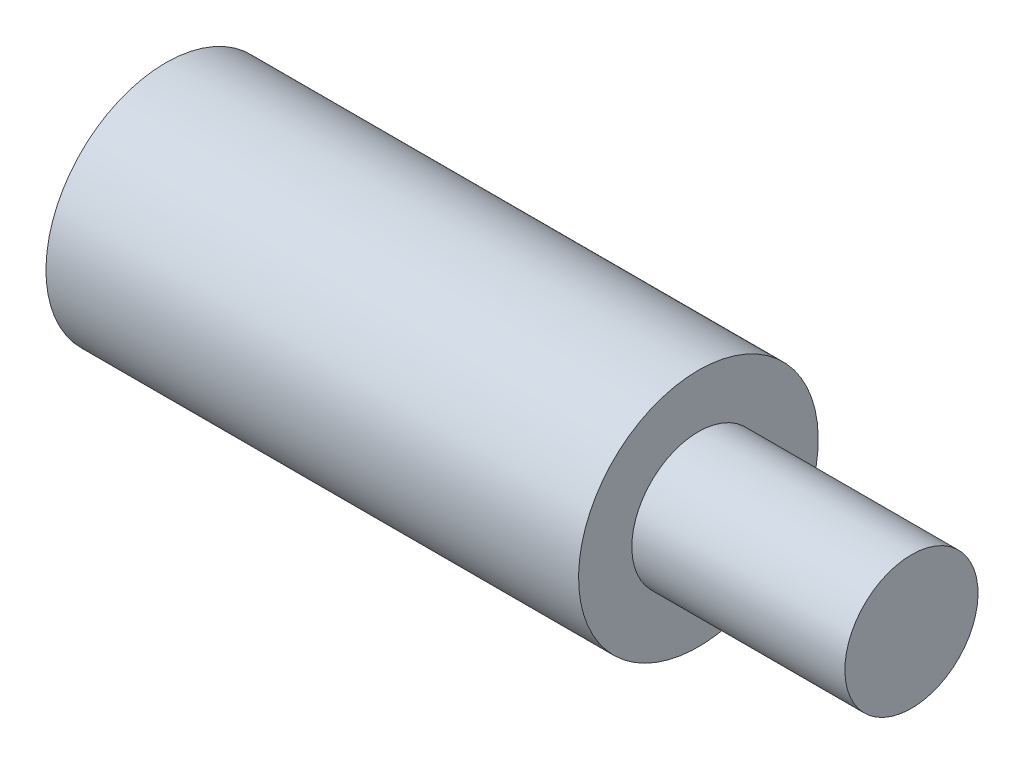
ISO-10303-21;
HEADER;
FILE_DESCRIPTION(('STEP AP214'),'2;1');
FILE_NAME('part.step','',(''),(''),'','','');
FILE_SCHEMA(('AUTOMOTIVE_DESIGN { 1 0 10303 214 1 1 1 1 }'));
ENDSEC;
DATA;
#1=APPLICATION_CONTEXT('core data for automotive mechanical design processes');
#2=APPLICATION_PROTOCOL_DEFINITION('international standard','automotive_design',2000,#1);
#3=PRODUCT_CONTEXT('',#1,'mechanical');
#4=PRODUCT('Part','Part','',(#3));
#5=PRODUCT_RELATED_PRODUCT_CATEGORY('part','',(#4));
#6=PRODUCT_DEFINITION_FORMATION('','',#4);
#7=PRODUCT_DEFINITION_CONTEXT('part definition',#1,'design');
#8=PRODUCT_DEFINITION('design','',#6,#7);
#9=PRODUCT_DEFINITION_SHAPE('','',#8);
#10=(LENGTH_UNIT() NAMED_UNIT(*) SI_UNIT(.MILLI.,.METRE.));
#11=(NAMED_UNIT(*) PLANE_ANGLE_UNIT() SI_UNIT($,.RADIAN.));
#12=(NAMED_UNIT(*) SI_UNIT($,.STERADIAN.) SOLID_ANGLE_UNIT());
#13=UNCERTAINTY_MEASURE_WITH_UNIT(LENGTH_MEASURE(1.E-05),#10,'distance_accuracy_value','');
#14=(GEOMETRIC_REPRESENTATION_CONTEXT(3) GLOBAL_UNCERTAINTY_ASSIGNED_CONTEXT((#13)) GLOBAL_UNIT_ASSIGNED_CONTEXT((#10,
#11,#12)) REPRESENTATION_CONTEXT('',''));
#15=CARTESIAN_POINT('',(0.,0.,0.));
#16=DIRECTION('',(0.,0.,1.));
#17=DIRECTION('',(1.,0.,0.));
#18=AXIS2_PLACEMENT_3D('',#15,#16,#17);
#19=CARTESIAN_POINT('',(0.,0.,0.));
#20=DIRECTION('',(-1.,0.,0.));
#21=DIRECTION('',(0.,-1.,0.));
#22=AXIS2_PLACEMENT_3D('',#19,#20,#21);
#23=PLANE('',#22);
#24=CARTESIAN_POINT('',(0.,5.,-5.));
#25=DIRECTION('',(-1.,0.,0.));
#26=DIRECTION('',(0.,0.,1.));
#27=AXIS2_PLACEMENT_3D('',#24,#25,#26);
#28=CIRCLE('',#27,1.25);
#29=CARTESIAN_POINT('',(0.,5.,-3.75));
#30=VERTEX_POINT('',#29);
#31=EDGE_CURVE('E76',#30,#30,#28,.T.);
#32=ORIENTED_EDGE('',*,*,#31,.F.);
#33=EDGE_LOOP('',(#32));
#34=FACE_BOUND('',#33,.T.);
#35=CARTESIAN_POINT('',(0.,5.,5.));
#36=DIRECTION('',(-1.,0.,0.));
#37=DIRECTION('',(0.,0.,1.));
#38=AXIS2_PLACEMENT_3D('',#35,#36,#37);
#39=CIRCLE('',#38,1.25);
#40=CARTESIAN_POINT('',(0.,5.,6.25));
#41=VERTEX_POINT('',#40);
#42=EDGE_CURVE('E75',#41,#41,#39,.T.);
#43=ORIENTED_EDGE('',*,*,#42,.F.);
#44=EDGE_LOOP('',(#43));
#45=FACE_BOUND('',#44,.T.);
#46=CARTESIAN_POINT('',(0.,-5.,5.));
#47=DIRECTION('',(-1.,0.,0.));
#48=DIRECTION('',(0.,0.,1.));
#49=AXIS2_PLACEMENT_3D('',#46,#47,#48);
#50=CIRCLE('',#49,1.25);
#51=CARTESIAN_POINT('',(0.,-5.,6.25));
#52=VERTEX_POINT('',#51);
#53=EDGE_CURVE('E86',#52,#52,#50,.T.);
#54=ORIENTED_EDGE('',*,*,#53,.F.);
#55=EDGE_LOOP('',(#54));
#56=FACE_BOUND('',#55,.T.);
#57=CARTESIAN_POINT('',(0.,-5.,-5.));
#58=DIRECTION('',(-1.,0.,0.));
#59=DIRECTION('',(0.,0.,1.));
#60=AXIS2_PLACEMENT_3D('',#57,#58,#59);
#61=CIRCLE('',#60,1.25);
#62=CARTESIAN_POINT('',(0.,-5.,-3.75));
#63=VERTEX_POINT('',#62);
#64=EDGE_CURVE('E92',#63,#63,#61,.T.);
#65=ORIENTED_EDGE('',*,*,#64,.F.);
#66=EDGE_LOOP('',(#65));
#67=FACE_BOUND('',#66,.T.);
#68=CARTESIAN_POINT('',(0.,0.,0.));
#69=DIRECTION('',(1.,0.,0.));
#70=DIRECTION('',(0.,1.,0.));
#71=AXIS2_PLACEMENT_3D('',#68,#69,#70);
#72=CIRCLE('',#71,8.99999999999999);
#73=CARTESIAN_POINT('',(0.,8.99999999999999,0.));
#74=VERTEX_POINT('',#73);
#75=EDGE_CURVE('E11',#74,#74,#72,.T.);
#76=ORIENTED_EDGE('',*,*,#75,.F.);
#77=EDGE_LOOP('',(#76));
#78=FACE_BOUND('',#77,.T.);
#79=ADVANCED_FACE('F45',(#34,#45,#56,#67,#78),#23,.T.);
#80=CARTESIAN_POINT('',(56.,0.,0.));
#81=DIRECTION('',(1.,0.,0.));
#82=DIRECTION('',(0.,1.,0.));
#83=AXIS2_PLACEMENT_3D('',#80,#81,#82);
#84=CYLINDRICAL_SURFACE('',#83,8.99999999999999);
#85=ORIENTED_EDGE('',*,*,#75,.T.);
#86=EDGE_LOOP('',(#85));
#87=FACE_BOUND('',#86,.T.);
#88=CARTESIAN_POINT('',(40.,0.,0.));
#89=DIRECTION('',(1.,0.,0.));
#90=DIRECTION('',(0.,1.,0.));
#91=AXIS2_PLACEMENT_3D('',#88,#89,#90);
#92=CIRCLE('',#91,8.99999999999999);
#93=CARTESIAN_POINT('',(40.,8.99999999999999,0.));
#94=VERTEX_POINT('',#93);
#95=EDGE_CURVE('E52',#94,#94,#92,.T.);
#96=ORIENTED_EDGE('',*,*,#95,.F.);
#97=EDGE_LOOP('',(#96));
#98=FACE_BOUND('',#97,.T.);
#99=ADVANCED_FACE('F109',(#87,#98),#84,.T.);
#100=CARTESIAN_POINT('',(40.,8.99999999999999,0.));
#101=DIRECTION('',(1.,0.,0.));
#102=DIRECTION('',(0.,1.,0.));
#103=AXIS2_PLACEMENT_3D('',#100,#101,#102);
#104=PLANE('',#103);
#105=ORIENTED_EDGE('',*,*,#95,.T.);
#106=EDGE_LOOP('',(#105));
#107=FACE_BOUND('',#106,.T.);
#108=CARTESIAN_POINT('',(40.,0.,0.));
#109=DIRECTION('',(1.,0.,0.));
#110=DIRECTION('',(0.,1.,0.));
#111=AXIS2_PLACEMENT_3D('',#108,#109,#110);
#112=CIRCLE('',#111,5.);
#113=CARTESIAN_POINT('',(40.,5.,0.));
#114=VERTEX_POINT('',#113);
#115=EDGE_CURVE('E101',#114,#114,#112,.T.);
#116=ORIENTED_EDGE('',*,*,#115,.F.);
#117=EDGE_LOOP('',(#116));
#118=FACE_BOUND('',#117,.T.);
#119=ADVANCED_FACE('F106',(#107,#118),#104,.T.);
#120=CARTESIAN_POINT('',(56.,0.,0.));
#121=DIRECTION('',(1.,0.,0.));
#122=DIRECTION('',(0.,1.,0.));
#123=AXIS2_PLACEMENT_3D('',#120,#121,#122);
#124=CYLINDRICAL_SURFACE('',#123,5.);
#125=ORIENTED_EDGE('',*,*,#115,.T.);
#126=EDGE_LOOP('',(#125));
#127=FACE_BOUND('',#126,.T.);
#128=CARTESIAN_POINT('',(56.,0.,0.));
#129=DIRECTION('',(1.,0.,0.));
#130=DIRECTION('',(0.,1.,0.));
#131=AXIS2_PLACEMENT_3D('',#128,#129,#130);
#132=CIRCLE('',#131,5.);
#133=CARTESIAN_POINT('',(56.,5.,0.));
#134=VERTEX_POINT('',#133);
#135=EDGE_CURVE('E98',#134,#134,#132,.T.);
#136=ORIENTED_EDGE('',*,*,#135,.F.);
#137=EDGE_LOOP('',(#136));
#138=FACE_BOUND('',#137,.T.);
#139=ADVANCED_FACE('F115',(#127,#138),#124,.T.);
#140=CARTESIAN_POINT('',(56.,5.,0.));
#141=DIRECTION('',(1.,0.,0.));
#142=DIRECTION('',(0.,1.,0.));
#143=AXIS2_PLACEMENT_3D('',#140,#141,#142);
#144=PLANE('',#143);
#145=ORIENTED_EDGE('',*,*,#135,.T.);
#146=EDGE_LOOP('',(#145));
#147=FACE_BOUND('',#146,.T.);
#148=ADVANCED_FACE('F122',(#147),#144,.T.);
#149=CARTESIAN_POINT('',(5.,-5.,-5.));
#150=DIRECTION('',(-1.,0.,0.));
#151=DIRECTION('',(0.,0.,1.));
#152=AXIS2_PLACEMENT_3D('',#149,#150,#151);
#153=CONICAL_SURFACE('',#152,1.25,1.02974425867665);
#154=CARTESIAN_POINT('',(5.75107577378445,-5.,-5.));
#155=VERTEX_POINT('',#154);
#156=VERTEX_LOOP('',#155);
#157=FACE_BOUND('',#156,.T.);
#158=CARTESIAN_POINT('',(5.,-5.,-5.));
#159=DIRECTION('',(-1.,0.,0.));
#160=DIRECTION('',(0.,0.,1.));
#161=AXIS2_PLACEMENT_3D('',#158,#159,#160);
#162=CIRCLE('',#161,1.25);
#163=CARTESIAN_POINT('',(5.,-5.,-3.75));
#164=VERTEX_POINT('',#163);
#165=EDGE_CURVE('E95',#164,#164,#162,.T.);
#166=ORIENTED_EDGE('',*,*,#165,.T.);
#167=EDGE_LOOP('',(#166));
#168=FACE_BOUND('',#167,.T.);
#169=ADVANCED_FACE('F126',(#157,#168),#153,.F.);
#170=CARTESIAN_POINT('',(0.,-5.,-5.));
#171=DIRECTION('',(-1.,0.,0.));
#172=DIRECTION('',(0.,0.,1.));
#173=AXIS2_PLACEMENT_3D('',#170,#171,#172);
#174=CYLINDRICAL_SURFACE('',#173,1.25);
#175=ORIENTED_EDGE('',*,*,#165,.F.);
#176=EDGE_LOOP('',(#175));
#177=FACE_BOUND('',#176,.T.);
#178=ORIENTED_EDGE('',*,*,#64,.T.);
#179=EDGE_LOOP('',(#178));
#180=FACE_BOUND('',#179,.T.);
#181=ADVANCED_FACE('F130',(#177,#180),#174,.F.);
#182=CARTESIAN_POINT('',(5.,-5.,5.));
#183=DIRECTION('',(-1.,0.,0.));
#184=DIRECTION('',(0.,0.,1.));
#185=AXIS2_PLACEMENT_3D('',#182,#183,#184);
#186=CONICAL_SURFACE('',#185,1.25,1.02974425867665);
#187=CARTESIAN_POINT('',(5.75107577378445,-5.,5.));
#188=VERTEX_POINT('',#187);
#189=VERTEX_LOOP('',#188);
#190=FACE_BOUND('',#189,.T.);
#191=CARTESIAN_POINT('',(5.,-5.,5.));
#192=DIRECTION('',(-1.,0.,0.));
#193=DIRECTION('',(0.,0.,1.));
#194=AXIS2_PLACEMENT_3D('',#191,#192,#193);
#195=CIRCLE('',#194,1.25);
#196=CARTESIAN_POINT('',(5.,-5.,6.25));
#197=VERTEX_POINT('',#196);
#198=EDGE_CURVE('E89',#197,#197,#195,.T.);
#199=ORIENTED_EDGE('',*,*,#198,.T.);
#200=EDGE_LOOP('',(#199));
#201=FACE_BOUND('',#200,.T.);
#202=ADVANCED_FACE('F133',(#190,#201),#186,.F.);
#203=CARTESIAN_POINT('',(0.,-5.,5.));
#204=DIRECTION('',(-1.,0.,0.));
#205=DIRECTION('',(0.,0.,1.));
#206=AXIS2_PLACEMENT_3D('',#203,#204,#205);
#207=CYLINDRICAL_SURFACE('',#206,1.25);
#208=ORIENTED_EDGE('',*,*,#198,.F.);
#209=EDGE_LOOP('',(#208));
#210=FACE_BOUND('',#209,.T.);
#211=ORIENTED_EDGE('',*,*,#53,.T.);
#212=EDGE_LOOP('',(#211));
#213=FACE_BOUND('',#212,.T.);
#214=ADVANCED_FACE('F137',(#210,#213),#207,.F.);
#215=CARTESIAN_POINT('',(5.,5.,5.));
#216=DIRECTION('',(-1.,0.,0.));
#217=DIRECTION('',(0.,0.,1.));
#218=AXIS2_PLACEMENT_3D('',#215,#216,#217);
#219=CONICAL_SURFACE('',#218,1.25,1.02974425867665);
#220=CARTESIAN_POINT('',(5.75107577378445,5.,5.));
#221=VERTEX_POINT('',#220);
#222=VERTEX_LOOP('',#221);
#223=FACE_BOUND('',#222,.T.);
#224=CARTESIAN_POINT('',(5.,5.,5.));
#225=DIRECTION('',(-1.,0.,0.));
#226=DIRECTION('',(0.,0.,1.));
#227=AXIS2_PLACEMENT_3D('',#224,#225,#226);
#228=CIRCLE('',#227,1.25);
#229=CARTESIAN_POINT('',(5.,5.,6.25));
#230=VERTEX_POINT('',#229);
#231=EDGE_CURVE('E79',#230,#230,#228,.T.);
#232=ORIENTED_EDGE('',*,*,#231,.T.);
#233=EDGE_LOOP('',(#232));
#234=FACE_BOUND('',#233,.T.);
#235=ADVANCED_FACE('F140',(#223,#234),#219,.F.);
#236=CARTESIAN_POINT('',(0.,5.,5.));
#237=DIRECTION('',(-1.,0.,0.));
#238=DIRECTION('',(0.,0.,1.));
#239=AXIS2_PLACEMENT_3D('',#236,#237,#238);
#240=CYLINDRICAL_SURFACE('',#239,1.25);
#241=ORIENTED_EDGE('',*,*,#231,.F.);
#242=EDGE_LOOP('',(#241));
#243=FACE_BOUND('',#242,.T.);
#244=ORIENTED_EDGE('',*,*,#42,.T.);
#245=EDGE_LOOP('',(#244));
#246=FACE_BOUND('',#245,.T.);
#247=ADVANCED_FACE('F69',(#243,#246),#240,.F.);
#248=CARTESIAN_POINT('',(5.,5.,-5.));
#249=DIRECTION('',(-1.,0.,0.));
#250=DIRECTION('',(0.,0.,1.));
#251=AXIS2_PLACEMENT_3D('',#248,#249,#250);
#252=CONICAL_SURFACE('',#251,1.25,1.02974425867665);
#253=CARTESIAN_POINT('',(5.75107577378445,5.,-5.));
#254=VERTEX_POINT('',#253);
#255=VERTEX_LOOP('',#254);
#256=FACE_BOUND('',#255,.T.);
#257=CARTESIAN_POINT('',(5.,5.,-5.));
#258=DIRECTION('',(-1.,0.,0.));
#259=DIRECTION('',(0.,0.,1.));
#260=AXIS2_PLACEMENT_3D('',#257,#258,#259);
#261=CIRCLE('',#260,1.25);
#262=CARTESIAN_POINT('',(5.,5.,-3.75));
#263=VERTEX_POINT('',#262);
#264=EDGE_CURVE('E73',#263,#263,#261,.T.);
#265=ORIENTED_EDGE('',*,*,#264,.T.);
#266=EDGE_LOOP('',(#265));
#267=FACE_BOUND('',#266,.T.);
#268=ADVANCED_FACE('F65',(#256,#267),#252,.F.);
#269=CARTESIAN_POINT('',(0.,5.,-5.));
#270=DIRECTION('',(-1.,0.,0.));
#271=DIRECTION('',(0.,0.,1.));
#272=AXIS2_PLACEMENT_3D('',#269,#270,#271);
#273=CYLINDRICAL_SURFACE('',#272,1.25);
#274=ORIENTED_EDGE('',*,*,#264,.F.);
#275=EDGE_LOOP('',(#274));
#276=FACE_BOUND('',#275,.T.);
#277=ORIENTED_EDGE('',*,*,#31,.T.);
#278=EDGE_LOOP('',(#277));
#279=FACE_BOUND('',#278,.T.);
#280=ADVANCED_FACE('F68',(#276,#279),#273,.F.);
#281=CLOSED_SHELL('',(#79,#99,#119,#139,#148,#169,#181,#202,#214,#235,#247,#268,#280));
#282=MANIFOLD_SOLID_BREP('B2',#281);
#283=ADVANCED_BREP_SHAPE_REPRESENTATION('',(#18,#282),#14);
#284=SHAPE_DEFINITION_REPRESENTATION(#9,#283);
ENDSEC;
END-ISO-10303-21;
